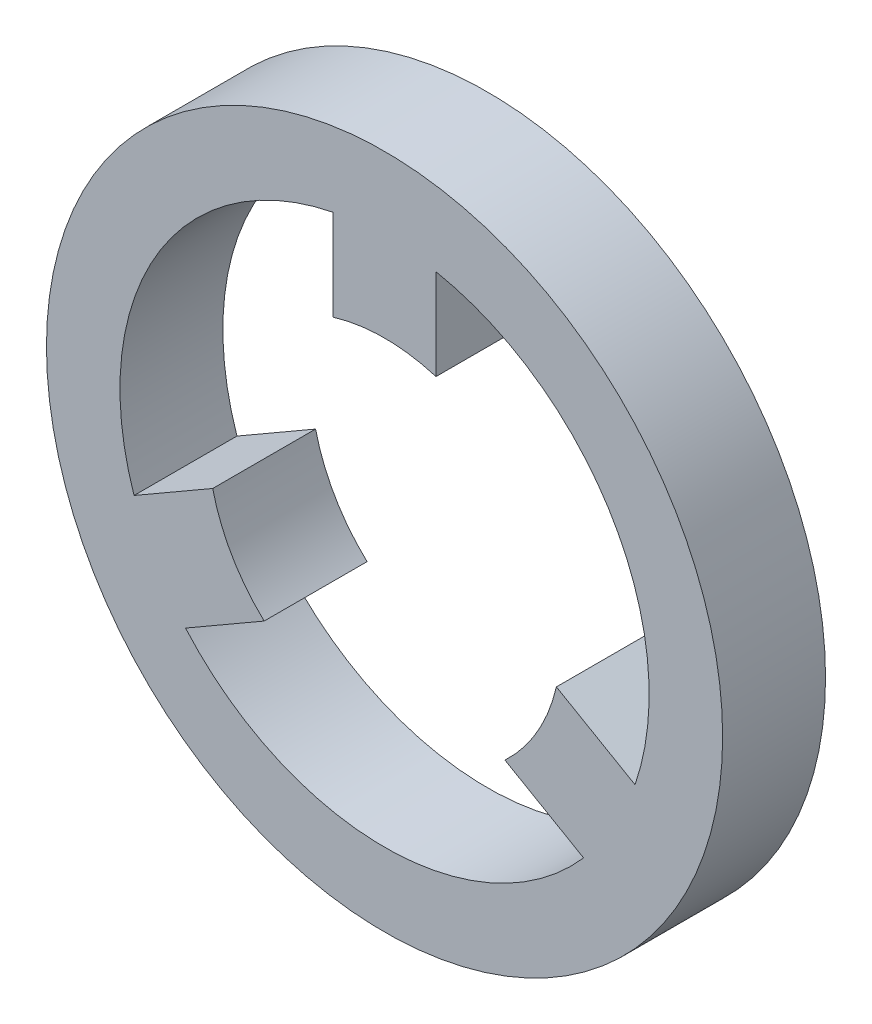
ISO-10303-21;
HEADER;
FILE_DESCRIPTION(('STEP AP214'),'2;1');
FILE_NAME('part.step','',(''),(''),'','','');
FILE_SCHEMA(('AUTOMOTIVE_DESIGN { 1 0 10303 214 1 1 1 1 }'));
ENDSEC;
DATA;
#1=APPLICATION_CONTEXT('core data for automotive mechanical design processes');
#2=APPLICATION_PROTOCOL_DEFINITION('international standard','automotive_design',2000,#1);
#3=PRODUCT_CONTEXT('',#1,'mechanical');
#4=PRODUCT('Part','Part','',(#3));
#5=PRODUCT_RELATED_PRODUCT_CATEGORY('part','',(#4));
#6=PRODUCT_DEFINITION_FORMATION('','',#4);
#7=PRODUCT_DEFINITION_CONTEXT('part definition',#1,'design');
#8=PRODUCT_DEFINITION('design','',#6,#7);
#9=PRODUCT_DEFINITION_SHAPE('','',#8);
#10=(LENGTH_UNIT() NAMED_UNIT(*) SI_UNIT(.MILLI.,.METRE.));
#11=(NAMED_UNIT(*) PLANE_ANGLE_UNIT() SI_UNIT($,.RADIAN.));
#12=(NAMED_UNIT(*) SI_UNIT($,.STERADIAN.) SOLID_ANGLE_UNIT());
#13=UNCERTAINTY_MEASURE_WITH_UNIT(LENGTH_MEASURE(1.E-05),#10,'distance_accuracy_value','');
#14=(GEOMETRIC_REPRESENTATION_CONTEXT(3) GLOBAL_UNCERTAINTY_ASSIGNED_CONTEXT((#13)) GLOBAL_UNIT_ASSIGNED_CONTEXT((#10,
#11,#12)) REPRESENTATION_CONTEXT('',''));
#15=CARTESIAN_POINT('',(0.,0.,0.));
#16=DIRECTION('',(0.,0.,1.));
#17=DIRECTION('',(1.,0.,0.));
#18=AXIS2_PLACEMENT_3D('',#15,#16,#17);
#19=CARTESIAN_POINT('',(0.,0.,3.5));
#20=DIRECTION('',(0.,0.,-1.));
#21=DIRECTION('',(-1.,0.,0.));
#22=AXIS2_PLACEMENT_3D('',#19,#20,#21);
#23=CYLINDRICAL_SURFACE('',#22,9.);
#24=CARTESIAN_POINT('',(0.,0.,0.));
#25=DIRECTION('',(0.,0.,1.));
#26=DIRECTION('',(1.,0.,0.));
#27=AXIS2_PLACEMENT_3D('',#24,#25,#26);
#28=CIRCLE('',#27,9.);
#29=CARTESIAN_POINT('',(8.5204643416865,-2.89856643912967,0.));
#30=VERTEX_POINT('',#29);
#31=CARTESIAN_POINT('',(1.75,8.82822179150479,0.));
#32=VERTEX_POINT('',#31);
#33=EDGE_CURVE('E162',#30,#32,#28,.T.);
#34=ORIENTED_EDGE('',*,*,#33,.F.);
#35=DIRECTION('',(0.,0.,-1.));
#36=VECTOR('',#35,1.);
#37=CARTESIAN_POINT('',(8.5204643416865,-2.89856643912967,3.5));
#38=LINE('',#37,#36);
#39=CARTESIAN_POINT('',(8.5204643416865,-2.89856643912967,3.5));
#40=VERTEX_POINT('',#39);
#41=EDGE_CURVE('E11',#40,#30,#38,.T.);
#42=ORIENTED_EDGE('',*,*,#41,.F.);
#43=CARTESIAN_POINT('',(0.,0.,3.5));
#44=DIRECTION('',(0.,0.,1.));
#45=DIRECTION('',(1.,0.,0.));
#46=AXIS2_PLACEMENT_3D('',#43,#44,#45);
#47=CIRCLE('',#46,9.);
#48=CARTESIAN_POINT('',(1.75,8.82822179150479,3.5));
#49=VERTEX_POINT('',#48);
#50=EDGE_CURVE('E193',#40,#49,#47,.T.);
#51=ORIENTED_EDGE('',*,*,#50,.T.);
#52=DIRECTION('',(0.,0.,-1.));
#53=VECTOR('',#52,1.);
#54=CARTESIAN_POINT('',(1.75,8.82822179150479,3.5));
#55=LINE('',#54,#53);
#56=EDGE_CURVE('E56',#49,#32,#55,.T.);
#57=ORIENTED_EDGE('',*,*,#56,.T.);
#58=EDGE_LOOP('',(#34,#42,#51,#57));
#59=FACE_BOUND('',#58,.T.);
#60=ADVANCED_FACE('F39',(#59),#23,.F.);
#61=CARTESIAN_POINT('',(0.875000000000006,1.51554445662276,3.5));
#62=DIRECTION('',(-0.500000000000004,-0.866025403784436,0.));
#63=DIRECTION('',(0.866025403784436,-0.500000000000004,0.));
#64=AXIS2_PLACEMENT_3D('',#61,#62,#63);
#65=PLANE('',#64);
#66=DIRECTION('',(-0.866025403784436,0.500000000000004,0.));
#67=VECTOR('',#66,1.);
#68=CARTESIAN_POINT('',(0.875000000000006,1.51554445662276,0.));
#69=LINE('',#68,#67);
#70=CARTESIAN_POINT('',(5.84522383801776,-1.35401561418951,0.));
#71=VERTEX_POINT('',#70);
#72=EDGE_CURVE('E164',#30,#71,#69,.T.);
#73=ORIENTED_EDGE('',*,*,#72,.T.);
#74=DIRECTION('',(0.,0.,-1.));
#75=VECTOR('',#74,1.);
#76=CARTESIAN_POINT('',(5.84522383801776,-1.35401561418951,3.5));
#77=LINE('',#76,#75);
#78=CARTESIAN_POINT('',(5.84522383801776,-1.35401561418951,3.5));
#79=VERTEX_POINT('',#78);
#80=EDGE_CURVE('E48',#79,#71,#77,.T.);
#81=ORIENTED_EDGE('',*,*,#80,.F.);
#82=DIRECTION('',(-0.866025403784436,0.500000000000004,0.));
#83=VECTOR('',#82,1.);
#84=CARTESIAN_POINT('',(0.875000000000006,1.51554445662276,3.5));
#85=LINE('',#84,#83);
#86=EDGE_CURVE('E231',#40,#79,#85,.T.);
#87=ORIENTED_EDGE('',*,*,#86,.F.);
#88=ORIENTED_EDGE('',*,*,#41,.T.);
#89=EDGE_LOOP('',(#73,#81,#87,#88));
#90=FACE_BOUND('',#89,.T.);
#91=ADVANCED_FACE('F41',(#90),#65,.F.);
#92=CARTESIAN_POINT('',(0.,0.,3.5));
#93=DIRECTION('',(0.,0.,-1.));
#94=DIRECTION('',(-1.,0.,0.));
#95=AXIS2_PLACEMENT_3D('',#92,#93,#94);
#96=CYLINDRICAL_SURFACE('',#95,6.);
#97=CARTESIAN_POINT('',(0.,0.,0.));
#98=DIRECTION('',(0.,0.,1.));
#99=DIRECTION('',(1.,0.,0.));
#100=AXIS2_PLACEMENT_3D('',#97,#98,#99);
#101=CIRCLE('',#100,6.);
#102=CARTESIAN_POINT('',(4.09522383801774,-4.38510452743504,0.));
#103=VERTEX_POINT('',#102);
#104=EDGE_CURVE('E169',#103,#71,#101,.T.);
#105=ORIENTED_EDGE('',*,*,#104,.F.);
#106=DIRECTION('',(0.,0.,-1.));
#107=VECTOR('',#106,1.);
#108=CARTESIAN_POINT('',(4.09522383801774,-4.38510452743504,3.5));
#109=LINE('',#108,#107);
#110=CARTESIAN_POINT('',(4.09522383801774,-4.38510452743504,3.5));
#111=VERTEX_POINT('',#110);
#112=EDGE_CURVE('E207',#111,#103,#109,.T.);
#113=ORIENTED_EDGE('',*,*,#112,.F.);
#114=CARTESIAN_POINT('',(0.,0.,3.5));
#115=DIRECTION('',(0.,0.,1.));
#116=DIRECTION('',(1.,0.,0.));
#117=AXIS2_PLACEMENT_3D('',#114,#115,#116);
#118=CIRCLE('',#117,6.);
#119=EDGE_CURVE('E214',#111,#79,#118,.T.);
#120=ORIENTED_EDGE('',*,*,#119,.T.);
#121=ORIENTED_EDGE('',*,*,#80,.T.);
#122=EDGE_LOOP('',(#105,#113,#120,#121));
#123=FACE_BOUND('',#122,.T.);
#124=ADVANCED_FACE('F212',(#123),#96,.F.);
#125=CARTESIAN_POINT('',(-0.875000000000007,-1.51554445662276,3.5));
#126=DIRECTION('',(-0.500000000000004,-0.866025403784436,0.));
#127=DIRECTION('',(0.866025403784436,-0.500000000000004,0.));
#128=AXIS2_PLACEMENT_3D('',#125,#126,#127);
#129=PLANE('',#128);
#130=DIRECTION('',(-0.866025403784436,0.500000000000004,0.));
#131=VECTOR('',#130,1.);
#132=CARTESIAN_POINT('',(-0.875000000000007,-1.51554445662276,0.));
#133=LINE('',#132,#131);
#134=CARTESIAN_POINT('',(6.77046434168649,-5.92965535237519,0.));
#135=VERTEX_POINT('',#134);
#136=EDGE_CURVE('E172',#135,#103,#133,.T.);
#137=ORIENTED_EDGE('',*,*,#136,.F.);
#138=DIRECTION('',(0.,0.,-1.));
#139=VECTOR('',#138,1.);
#140=CARTESIAN_POINT('',(6.77046434168649,-5.92965535237519,3.5));
#141=LINE('',#140,#139);
#142=CARTESIAN_POINT('',(6.77046434168649,-5.92965535237519,3.5));
#143=VERTEX_POINT('',#142);
#144=EDGE_CURVE('E205',#143,#135,#141,.T.);
#145=ORIENTED_EDGE('',*,*,#144,.F.);
#146=DIRECTION('',(-0.866025403784436,0.500000000000004,0.));
#147=VECTOR('',#146,1.);
#148=CARTESIAN_POINT('',(-0.875000000000007,-1.51554445662276,3.5));
#149=LINE('',#148,#147);
#150=EDGE_CURVE('E228',#143,#111,#149,.T.);
#151=ORIENTED_EDGE('',*,*,#150,.T.);
#152=ORIENTED_EDGE('',*,*,#112,.T.);
#153=EDGE_LOOP('',(#137,#145,#151,#152));
#154=FACE_BOUND('',#153,.T.);
#155=ADVANCED_FACE('F225',(#154),#129,.T.);
#156=CARTESIAN_POINT('',(-6.77046434168657,-5.9296553523751,0.));
#157=VERTEX_POINT('',#156);
#158=EDGE_CURVE('E166',#157,#135,#28,.T.);
#159=ORIENTED_EDGE('',*,*,#158,.F.);
#160=DIRECTION('',(0.,0.,-1.));
#161=VECTOR('',#160,1.);
#162=CARTESIAN_POINT('',(-6.77046434168657,-5.9296553523751,3.5));
#163=LINE('',#162,#161);
#164=CARTESIAN_POINT('',(-6.77046434168657,-5.9296553523751,3.5));
#165=VERTEX_POINT('',#164);
#166=EDGE_CURVE('E203',#165,#157,#163,.T.);
#167=ORIENTED_EDGE('',*,*,#166,.F.);
#168=EDGE_CURVE('E233',#165,#143,#47,.T.);
#169=ORIENTED_EDGE('',*,*,#168,.T.);
#170=ORIENTED_EDGE('',*,*,#144,.T.);
#171=EDGE_LOOP('',(#159,#167,#169,#170));
#172=FACE_BOUND('',#171,.T.);
#173=ADVANCED_FACE('F259',(#172),#23,.F.);
#174=CARTESIAN_POINT('',(0.874999999999986,-1.51554445662278,3.5));
#175=DIRECTION('',(-0.499999999999992,0.866025403784443,0.));
#176=DIRECTION('',(-0.866025403784443,-0.499999999999992,0.));
#177=AXIS2_PLACEMENT_3D('',#174,#175,#176);
#178=PLANE('',#177);
#179=DIRECTION('',(0.866025403784443,0.499999999999992,0.));
#180=VECTOR('',#179,1.);
#181=CARTESIAN_POINT('',(0.874999999999986,-1.51554445662278,0.));
#182=LINE('',#181,#180);
#183=CARTESIAN_POINT('',(-4.0952238380178,-4.38510452743498,0.));
#184=VERTEX_POINT('',#183);
#185=EDGE_CURVE('E175',#157,#184,#182,.T.);
#186=ORIENTED_EDGE('',*,*,#185,.T.);
#187=DIRECTION('',(0.,0.,-1.));
#188=VECTOR('',#187,1.);
#189=CARTESIAN_POINT('',(-4.0952238380178,-4.38510452743498,3.5));
#190=LINE('',#189,#188);
#191=CARTESIAN_POINT('',(-4.0952238380178,-4.38510452743498,3.5));
#192=VERTEX_POINT('',#191);
#193=EDGE_CURVE('E201',#192,#184,#190,.T.);
#194=ORIENTED_EDGE('',*,*,#193,.F.);
#195=DIRECTION('',(0.866025403784443,0.499999999999992,0.));
#196=VECTOR('',#195,1.);
#197=CARTESIAN_POINT('',(0.874999999999986,-1.51554445662278,3.5));
#198=LINE('',#197,#196);
#199=EDGE_CURVE('E238',#165,#192,#198,.T.);
#200=ORIENTED_EDGE('',*,*,#199,.F.);
#201=ORIENTED_EDGE('',*,*,#166,.T.);
#202=EDGE_LOOP('',(#186,#194,#200,#201));
#203=FACE_BOUND('',#202,.T.);
#204=ADVANCED_FACE('F267',(#203),#178,.F.);
#205=CARTESIAN_POINT('',(0.,0.,3.5));
#206=DIRECTION('',(0.,0.,-1.));
#207=DIRECTION('',(-1.,0.,0.));
#208=AXIS2_PLACEMENT_3D('',#205,#206,#207);
#209=CYLINDRICAL_SURFACE('',#208,6.);
#210=CARTESIAN_POINT('',(0.,0.,0.));
#211=DIRECTION('',(0.,0.,1.));
#212=DIRECTION('',(1.,0.,0.));
#213=AXIS2_PLACEMENT_3D('',#210,#211,#212);
#214=CIRCLE('',#213,6.);
#215=CARTESIAN_POINT('',(-5.84522383801778,-1.35401561418943,0.));
#216=VERTEX_POINT('',#215);
#217=EDGE_CURVE('E178',#216,#184,#214,.T.);
#218=ORIENTED_EDGE('',*,*,#217,.F.);
#219=DIRECTION('',(0.,0.,-1.));
#220=VECTOR('',#219,1.);
#221=CARTESIAN_POINT('',(-5.84522383801778,-1.35401561418943,3.5));
#222=LINE('',#221,#220);
#223=CARTESIAN_POINT('',(-5.84522383801778,-1.35401561418943,3.5));
#224=VERTEX_POINT('',#223);
#225=EDGE_CURVE('E199',#224,#216,#222,.T.);
#226=ORIENTED_EDGE('',*,*,#225,.F.);
#227=CARTESIAN_POINT('',(0.,0.,3.5));
#228=DIRECTION('',(0.,0.,1.));
#229=DIRECTION('',(1.,0.,0.));
#230=AXIS2_PLACEMENT_3D('',#227,#228,#229);
#231=CIRCLE('',#230,6.);
#232=EDGE_CURVE('E240',#224,#192,#231,.T.);
#233=ORIENTED_EDGE('',*,*,#232,.T.);
#234=ORIENTED_EDGE('',*,*,#193,.T.);
#235=EDGE_LOOP('',(#218,#226,#233,#234));
#236=FACE_BOUND('',#235,.T.);
#237=ADVANCED_FACE('F275',(#236),#209,.F.);
#238=CARTESIAN_POINT('',(-0.874999999999986,1.51554445662278,3.5));
#239=DIRECTION('',(-0.499999999999992,0.866025403784443,0.));
#240=DIRECTION('',(-0.866025403784443,-0.499999999999992,0.));
#241=AXIS2_PLACEMENT_3D('',#238,#239,#240);
#242=PLANE('',#241);
#243=DIRECTION('',(0.866025403784443,0.499999999999992,0.));
#244=VECTOR('',#243,1.);
#245=CARTESIAN_POINT('',(-0.874999999999986,1.51554445662278,0.));
#246=LINE('',#245,#244);
#247=CARTESIAN_POINT('',(-8.52046434168654,-2.89856643912955,0.));
#248=VERTEX_POINT('',#247);
#249=EDGE_CURVE('E181',#248,#216,#246,.T.);
#250=ORIENTED_EDGE('',*,*,#249,.F.);
#251=DIRECTION('',(0.,0.,-1.));
#252=VECTOR('',#251,1.);
#253=CARTESIAN_POINT('',(-8.52046434168654,-2.89856643912955,3.5));
#254=LINE('',#253,#252);
#255=CARTESIAN_POINT('',(-8.52046434168654,-2.89856643912955,3.5));
#256=VERTEX_POINT('',#255);
#257=EDGE_CURVE('E197',#256,#248,#254,.T.);
#258=ORIENTED_EDGE('',*,*,#257,.F.);
#259=DIRECTION('',(0.866025403784443,0.499999999999992,0.));
#260=VECTOR('',#259,1.);
#261=CARTESIAN_POINT('',(-0.874999999999986,1.51554445662278,3.5));
#262=LINE('',#261,#260);
#263=EDGE_CURVE('E242',#256,#224,#262,.T.);
#264=ORIENTED_EDGE('',*,*,#263,.T.);
#265=ORIENTED_EDGE('',*,*,#225,.T.);
#266=EDGE_LOOP('',(#250,#258,#264,#265));
#267=FACE_BOUND('',#266,.T.);
#268=ADVANCED_FACE('F270',(#267),#242,.T.);
#269=CARTESIAN_POINT('',(-1.75,8.82822179150479,0.));
#270=VERTEX_POINT('',#269);
#271=EDGE_CURVE('E165',#270,#248,#28,.T.);
#272=ORIENTED_EDGE('',*,*,#271,.F.);
#273=DIRECTION('',(0.,0.,-1.));
#274=VECTOR('',#273,1.);
#275=CARTESIAN_POINT('',(-1.75,8.82822179150479,3.5));
#276=LINE('',#275,#274);
#277=CARTESIAN_POINT('',(-1.75,8.82822179150479,3.5));
#278=VERTEX_POINT('',#277);
#279=EDGE_CURVE('E151',#278,#270,#276,.T.);
#280=ORIENTED_EDGE('',*,*,#279,.F.);
#281=EDGE_CURVE('E141',#278,#256,#47,.T.);
#282=ORIENTED_EDGE('',*,*,#281,.T.);
#283=ORIENTED_EDGE('',*,*,#257,.T.);
#284=EDGE_LOOP('',(#272,#280,#282,#283));
#285=FACE_BOUND('',#284,.T.);
#286=ADVANCED_FACE('F260',(#285),#23,.F.);
#287=CARTESIAN_POINT('',(-1.75,0.,3.5));
#288=DIRECTION('',(1.,0.,0.));
#289=DIRECTION('',(0.,1.,0.));
#290=AXIS2_PLACEMENT_3D('',#287,#288,#289);
#291=PLANE('',#290);
#292=DIRECTION('',(0.,-1.,0.));
#293=VECTOR('',#292,1.);
#294=CARTESIAN_POINT('',(-1.75,0.,0.));
#295=LINE('',#294,#293);
#296=CARTESIAN_POINT('',(-1.75,5.7391201416245,0.));
#297=VERTEX_POINT('',#296);
#298=EDGE_CURVE('E148',#270,#297,#295,.T.);
#299=ORIENTED_EDGE('',*,*,#298,.T.);
#300=DIRECTION('',(0.,0.,-1.));
#301=VECTOR('',#300,1.);
#302=CARTESIAN_POINT('',(-1.75,5.7391201416245,3.5));
#303=LINE('',#302,#301);
#304=CARTESIAN_POINT('',(-1.75,5.7391201416245,3.5));
#305=VERTEX_POINT('',#304);
#306=EDGE_CURVE('E145',#305,#297,#303,.T.);
#307=ORIENTED_EDGE('',*,*,#306,.F.);
#308=DIRECTION('',(0.,-1.,0.));
#309=VECTOR('',#308,1.);
#310=CARTESIAN_POINT('',(-1.75,0.,3.5));
#311=LINE('',#310,#309);
#312=EDGE_CURVE('E131',#278,#305,#311,.T.);
#313=ORIENTED_EDGE('',*,*,#312,.F.);
#314=ORIENTED_EDGE('',*,*,#279,.T.);
#315=EDGE_LOOP('',(#299,#307,#313,#314));
#316=FACE_BOUND('',#315,.T.);
#317=ADVANCED_FACE('F146',(#316),#291,.F.);
#318=CARTESIAN_POINT('',(0.,0.,3.5));
#319=DIRECTION('',(0.,0.,-1.));
#320=DIRECTION('',(-1.,0.,0.));
#321=AXIS2_PLACEMENT_3D('',#318,#319,#320);
#322=CYLINDRICAL_SURFACE('',#321,6.);
#323=CARTESIAN_POINT('',(0.,0.,0.));
#324=DIRECTION('',(0.,0.,1.));
#325=DIRECTION('',(1.,0.,0.));
#326=AXIS2_PLACEMENT_3D('',#323,#324,#325);
#327=CIRCLE('',#326,6.);
#328=CARTESIAN_POINT('',(1.75,5.7391201416245,0.));
#329=VERTEX_POINT('',#328);
#330=EDGE_CURVE('E185',#329,#297,#327,.T.);
#331=ORIENTED_EDGE('',*,*,#330,.F.);
#332=DIRECTION('',(0.,0.,-1.));
#333=VECTOR('',#332,1.);
#334=CARTESIAN_POINT('',(1.75,5.7391201416245,3.5));
#335=LINE('',#334,#333);
#336=CARTESIAN_POINT('',(1.75,5.7391201416245,3.5));
#337=VERTEX_POINT('',#336);
#338=EDGE_CURVE('E93',#337,#329,#335,.T.);
#339=ORIENTED_EDGE('',*,*,#338,.F.);
#340=CARTESIAN_POINT('',(0.,0.,3.5));
#341=DIRECTION('',(0.,0.,1.));
#342=DIRECTION('',(1.,0.,0.));
#343=AXIS2_PLACEMENT_3D('',#340,#341,#342);
#344=CIRCLE('',#343,6.);
#345=EDGE_CURVE('E138',#337,#305,#344,.T.);
#346=ORIENTED_EDGE('',*,*,#345,.T.);
#347=ORIENTED_EDGE('',*,*,#306,.T.);
#348=EDGE_LOOP('',(#331,#339,#346,#347));
#349=FACE_BOUND('',#348,.T.);
#350=ADVANCED_FACE('F153',(#349),#322,.F.);
#351=CARTESIAN_POINT('',(1.75,0.,3.5));
#352=DIRECTION('',(1.,0.,0.));
#353=DIRECTION('',(0.,1.,0.));
#354=AXIS2_PLACEMENT_3D('',#351,#352,#353);
#355=PLANE('',#354);
#356=DIRECTION('',(0.,-1.,0.));
#357=VECTOR('',#356,1.);
#358=CARTESIAN_POINT('',(1.75,0.,0.));
#359=LINE('',#358,#357);
#360=EDGE_CURVE('E187',#32,#329,#359,.T.);
#361=ORIENTED_EDGE('',*,*,#360,.F.);
#362=ORIENTED_EDGE('',*,*,#56,.F.);
#363=DIRECTION('',(0.,-1.,0.));
#364=VECTOR('',#363,1.);
#365=CARTESIAN_POINT('',(1.75,0.,3.5));
#366=LINE('',#365,#364);
#367=EDGE_CURVE('E154',#49,#337,#366,.T.);
#368=ORIENTED_EDGE('',*,*,#367,.T.);
#369=ORIENTED_EDGE('',*,*,#338,.T.);
#370=EDGE_LOOP('',(#361,#362,#368,#369));
#371=FACE_BOUND('',#370,.T.);
#372=ADVANCED_FACE('F246',(#371),#355,.T.);
#373=CARTESIAN_POINT('',(0.,0.,3.5));
#374=DIRECTION('',(0.,0.,-1.));
#375=DIRECTION('',(-1.,0.,0.));
#376=AXIS2_PLACEMENT_3D('',#373,#374,#375);
#377=CYLINDRICAL_SURFACE('',#376,11.5);
#378=CARTESIAN_POINT('',(0.,0.,3.5));
#379=DIRECTION('',(0.,0.,1.));
#380=DIRECTION('',(1.,0.,0.));
#381=AXIS2_PLACEMENT_3D('',#378,#379,#380);
#382=CIRCLE('',#381,11.5);
#383=CARTESIAN_POINT('',(11.5,0.,3.5));
#384=VERTEX_POINT('',#383);
#385=EDGE_CURVE('E156',#384,#384,#382,.T.);
#386=ORIENTED_EDGE('',*,*,#385,.F.);
#387=EDGE_LOOP('',(#386));
#388=FACE_BOUND('',#387,.T.);
#389=CARTESIAN_POINT('',(0.,0.,0.));
#390=DIRECTION('',(0.,0.,1.));
#391=DIRECTION('',(1.,0.,0.));
#392=AXIS2_PLACEMENT_3D('',#389,#390,#391);
#393=CIRCLE('',#392,11.5);
#394=CARTESIAN_POINT('',(11.5,0.,0.));
#395=VERTEX_POINT('',#394);
#396=EDGE_CURVE('E190',#395,#395,#393,.T.);
#397=ORIENTED_EDGE('',*,*,#396,.T.);
#398=EDGE_LOOP('',(#397));
#399=FACE_BOUND('',#398,.T.);
#400=ADVANCED_FACE('F248',(#388,#399),#377,.T.);
#401=CARTESIAN_POINT('',(0.,0.,3.5));
#402=DIRECTION('',(0.,0.,1.));
#403=DIRECTION('',(1.,0.,0.));
#404=AXIS2_PLACEMENT_3D('',#401,#402,#403);
#405=PLANE('',#404);
#406=ORIENTED_EDGE('',*,*,#50,.F.);
#407=ORIENTED_EDGE('',*,*,#86,.T.);
#408=ORIENTED_EDGE('',*,*,#119,.F.);
#409=ORIENTED_EDGE('',*,*,#150,.F.);
#410=ORIENTED_EDGE('',*,*,#168,.F.);
#411=ORIENTED_EDGE('',*,*,#199,.T.);
#412=ORIENTED_EDGE('',*,*,#232,.F.);
#413=ORIENTED_EDGE('',*,*,#263,.F.);
#414=ORIENTED_EDGE('',*,*,#281,.F.);
#415=ORIENTED_EDGE('',*,*,#312,.T.);
#416=ORIENTED_EDGE('',*,*,#345,.F.);
#417=ORIENTED_EDGE('',*,*,#367,.F.);
#418=EDGE_LOOP('',(#406,#407,#408,#409,#410,#411,#412,#413,#414,#415,#416,#417));
#419=FACE_BOUND('',#418,.T.);
#420=ORIENTED_EDGE('',*,*,#385,.T.);
#421=EDGE_LOOP('',(#420));
#422=FACE_BOUND('',#421,.T.);
#423=ADVANCED_FACE('F134',(#419,#422),#405,.T.);
#424=CARTESIAN_POINT('',(0.,0.,0.));
#425=DIRECTION('',(0.,0.,1.));
#426=DIRECTION('',(1.,0.,0.));
#427=AXIS2_PLACEMENT_3D('',#424,#425,#426);
#428=PLANE('',#427);
#429=ORIENTED_EDGE('',*,*,#33,.T.);
#430=ORIENTED_EDGE('',*,*,#360,.T.);
#431=ORIENTED_EDGE('',*,*,#330,.T.);
#432=ORIENTED_EDGE('',*,*,#298,.F.);
#433=ORIENTED_EDGE('',*,*,#271,.T.);
#434=ORIENTED_EDGE('',*,*,#249,.T.);
#435=ORIENTED_EDGE('',*,*,#217,.T.);
#436=ORIENTED_EDGE('',*,*,#185,.F.);
#437=ORIENTED_EDGE('',*,*,#158,.T.);
#438=ORIENTED_EDGE('',*,*,#136,.T.);
#439=ORIENTED_EDGE('',*,*,#104,.T.);
#440=ORIENTED_EDGE('',*,*,#72,.F.);
#441=EDGE_LOOP('',(#429,#430,#431,#432,#433,#434,#435,#436,#437,#438,#439,#440));
#442=FACE_BOUND('',#441,.T.);
#443=ORIENTED_EDGE('',*,*,#396,.F.);
#444=EDGE_LOOP('',(#443));
#445=FACE_BOUND('',#444,.T.);
#446=ADVANCED_FACE('F218',(#442,#445),#428,.F.);
#447=CLOSED_SHELL('',(#60,#91,#124,#155,#173,#204,#237,#268,#286,#317,#350,#372,#400,#423,#446));
#448=MANIFOLD_SOLID_BREP('B2',#447);
#449=ADVANCED_BREP_SHAPE_REPRESENTATION('',(#18,#448),#14);
#450=SHAPE_DEFINITION_REPRESENTATION(#9,#449);
ENDSEC;
END-ISO-10303-21;
